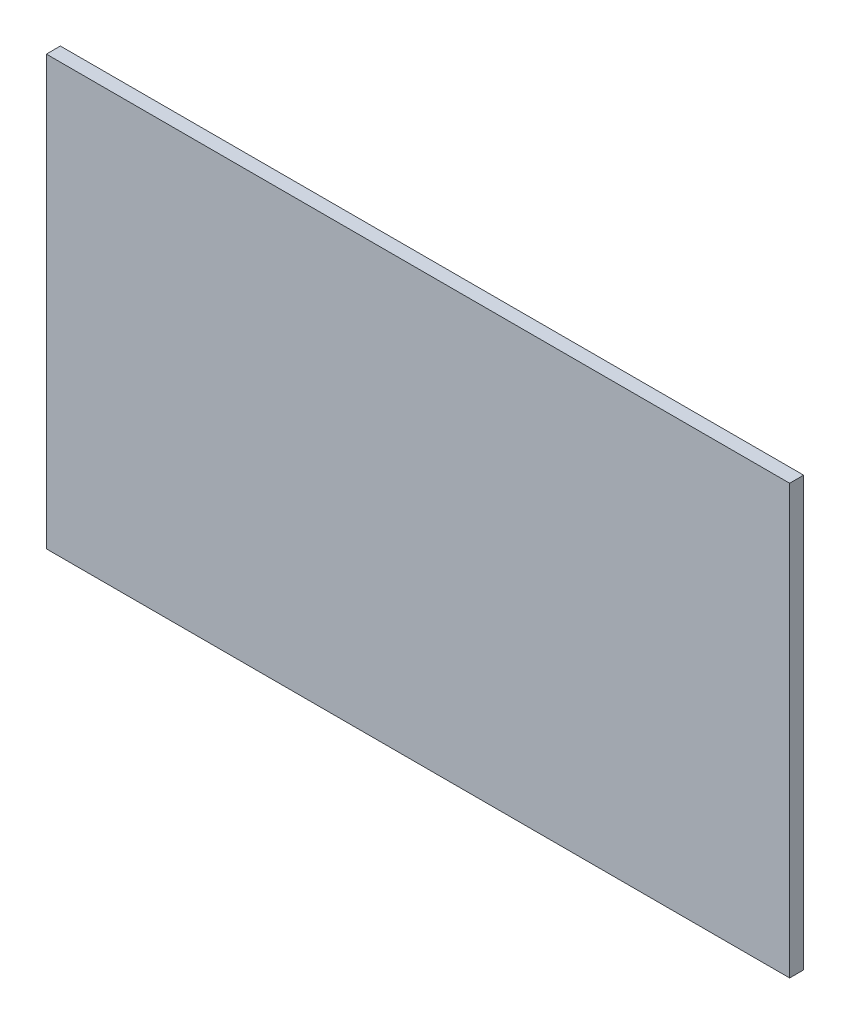
ISO-10303-21;
HEADER;
FILE_DESCRIPTION(('STEP AP214'),'2;1');
FILE_NAME('part.step','',(''),(''),'','','');
FILE_SCHEMA(('AUTOMOTIVE_DESIGN { 1 0 10303 214 1 1 1 1 }'));
ENDSEC;
DATA;
#1=APPLICATION_CONTEXT('core data for automotive mechanical design processes');
#2=APPLICATION_PROTOCOL_DEFINITION('international standard','automotive_design',2000,#1);
#3=PRODUCT_CONTEXT('',#1,'mechanical');
#4=PRODUCT('Part','Part','',(#3));
#5=PRODUCT_RELATED_PRODUCT_CATEGORY('part','',(#4));
#6=PRODUCT_DEFINITION_FORMATION('','',#4);
#7=PRODUCT_DEFINITION_CONTEXT('part definition',#1,'design');
#8=PRODUCT_DEFINITION('design','',#6,#7);
#9=PRODUCT_DEFINITION_SHAPE('','',#8);
#10=(LENGTH_UNIT() NAMED_UNIT(*) SI_UNIT(.MILLI.,.METRE.));
#11=(NAMED_UNIT(*) PLANE_ANGLE_UNIT() SI_UNIT($,.RADIAN.));
#12=(NAMED_UNIT(*) SI_UNIT($,.STERADIAN.) SOLID_ANGLE_UNIT());
#13=UNCERTAINTY_MEASURE_WITH_UNIT(LENGTH_MEASURE(1.E-05),#10,'distance_accuracy_value','');
#14=(GEOMETRIC_REPRESENTATION_CONTEXT(3) GLOBAL_UNCERTAINTY_ASSIGNED_CONTEXT((#13)) GLOBAL_UNIT_ASSIGNED_CONTEXT((#10,
#11,#12)) REPRESENTATION_CONTEXT('',''));
#15=CARTESIAN_POINT('',(0.,0.,0.));
#16=DIRECTION('',(0.,0.,1.));
#17=DIRECTION('',(1.,0.,0.));
#18=AXIS2_PLACEMENT_3D('',#15,#16,#17);
#19=CARTESIAN_POINT('',(-73.8944174376666,61.9928571428572,1.6));
#20=DIRECTION('',(1.,0.,0.));
#21=DIRECTION('',(0.,0.,-1.));
#22=AXIS2_PLACEMENT_3D('',#19,#20,#21);
#23=PLANE('',#22);
#24=DIRECTION('',(0.,-1.,0.));
#25=VECTOR('',#24,1.);
#26=CARTESIAN_POINT('',(-73.8944174376666,61.9928571428572,0.));
#27=LINE('',#26,#25);
#28=CARTESIAN_POINT('',(-73.8944174376666,61.9928571428572,0.));
#29=VERTEX_POINT('',#28);
#30=CARTESIAN_POINT('',(-73.8944174376666,12.9928571428572,0.));
#31=VERTEX_POINT('',#30);
#32=EDGE_CURVE('E96',#29,#31,#27,.T.);
#33=ORIENTED_EDGE('',*,*,#32,.T.);
#34=DIRECTION('',(0.,0.,-1.));
#35=VECTOR('',#34,1.);
#36=CARTESIAN_POINT('',(-73.8944174376666,12.9928571428572,1.6));
#37=LINE('',#36,#35);
#38=CARTESIAN_POINT('',(-73.8944174376666,12.9928571428572,1.6));
#39=VERTEX_POINT('',#38);
#40=EDGE_CURVE('E11',#39,#31,#37,.T.);
#41=ORIENTED_EDGE('',*,*,#40,.F.);
#42=DIRECTION('',(0.,-1.,0.));
#43=VECTOR('',#42,1.);
#44=CARTESIAN_POINT('',(-73.8944174376666,61.9928571428572,1.6));
#45=LINE('',#44,#43);
#46=CARTESIAN_POINT('',(-73.8944174376666,61.9928571428572,1.6));
#47=VERTEX_POINT('',#46);
#48=EDGE_CURVE('E84',#47,#39,#45,.T.);
#49=ORIENTED_EDGE('',*,*,#48,.F.);
#50=DIRECTION('',(0.,0.,-1.));
#51=VECTOR('',#50,1.);
#52=CARTESIAN_POINT('',(-73.8944174376666,61.9928571428572,1.6));
#53=LINE('',#52,#51);
#54=EDGE_CURVE('E92',#47,#29,#53,.T.);
#55=ORIENTED_EDGE('',*,*,#54,.T.);
#56=EDGE_LOOP('',(#33,#41,#49,#55));
#57=FACE_BOUND('',#56,.T.);
#58=ADVANCED_FACE('F33',(#57),#23,.F.);
#59=CARTESIAN_POINT('',(-73.8944174376666,12.9928571428572,1.6));
#60=DIRECTION('',(0.,1.,0.));
#61=DIRECTION('',(0.,0.,1.));
#62=AXIS2_PLACEMENT_3D('',#59,#60,#61);
#63=PLANE('',#62);
#64=DIRECTION('',(1.,0.,0.));
#65=VECTOR('',#64,1.);
#66=CARTESIAN_POINT('',(-73.8944174376666,12.9928571428572,0.));
#67=LINE('',#66,#65);
#68=CARTESIAN_POINT('',(11.1055825623334,12.9928571428572,0.));
#69=VERTEX_POINT('',#68);
#70=EDGE_CURVE('E88',#31,#69,#67,.T.);
#71=ORIENTED_EDGE('',*,*,#70,.T.);
#72=DIRECTION('',(0.,0.,-1.));
#73=VECTOR('',#72,1.);
#74=CARTESIAN_POINT('',(11.1055825623334,12.9928571428572,1.6));
#75=LINE('',#74,#73);
#76=CARTESIAN_POINT('',(11.1055825623334,12.9928571428572,1.6));
#77=VERTEX_POINT('',#76);
#78=EDGE_CURVE('E41',#77,#69,#75,.T.);
#79=ORIENTED_EDGE('',*,*,#78,.F.);
#80=DIRECTION('',(1.,0.,0.));
#81=VECTOR('',#80,1.);
#82=CARTESIAN_POINT('',(-73.8944174376666,12.9928571428572,1.6));
#83=LINE('',#82,#81);
#84=EDGE_CURVE('E79',#39,#77,#83,.T.);
#85=ORIENTED_EDGE('',*,*,#84,.F.);
#86=ORIENTED_EDGE('',*,*,#40,.T.);
#87=EDGE_LOOP('',(#71,#79,#85,#86));
#88=FACE_BOUND('',#87,.T.);
#89=ADVANCED_FACE('F87',(#88),#63,.F.);
#90=CARTESIAN_POINT('',(11.1055825623334,61.9928571428572,1.6));
#91=DIRECTION('',(-1.,0.,0.));
#92=DIRECTION('',(0.,0.,1.));
#93=AXIS2_PLACEMENT_3D('',#90,#91,#92);
#94=PLANE('',#93);
#95=DIRECTION('',(0.,1.,0.));
#96=VECTOR('',#95,1.);
#97=CARTESIAN_POINT('',(11.1055825623334,61.9928571428572,0.));
#98=LINE('',#97,#96);
#99=CARTESIAN_POINT('',(11.1055825623334,61.9928571428572,0.));
#100=VERTEX_POINT('',#99);
#101=EDGE_CURVE('E66',#69,#100,#98,.T.);
#102=ORIENTED_EDGE('',*,*,#101,.T.);
#103=DIRECTION('',(0.,0.,-1.));
#104=VECTOR('',#103,1.);
#105=CARTESIAN_POINT('',(11.1055825623334,61.9928571428572,1.6));
#106=LINE('',#105,#104);
#107=CARTESIAN_POINT('',(11.1055825623334,61.9928571428572,1.6));
#108=VERTEX_POINT('',#107);
#109=EDGE_CURVE('E89',#108,#100,#106,.T.);
#110=ORIENTED_EDGE('',*,*,#109,.F.);
#111=DIRECTION('',(0.,1.,0.));
#112=VECTOR('',#111,1.);
#113=CARTESIAN_POINT('',(11.1055825623334,61.9928571428572,1.6));
#114=LINE('',#113,#112);
#115=EDGE_CURVE('E82',#77,#108,#114,.T.);
#116=ORIENTED_EDGE('',*,*,#115,.F.);
#117=ORIENTED_EDGE('',*,*,#78,.T.);
#118=EDGE_LOOP('',(#102,#110,#116,#117));
#119=FACE_BOUND('',#118,.T.);
#120=ADVANCED_FACE('F90',(#119),#94,.F.);
#121=CARTESIAN_POINT('',(-73.8944174376666,61.9928571428572,1.6));
#122=DIRECTION('',(0.,-1.,0.));
#123=DIRECTION('',(0.,0.,-1.));
#124=AXIS2_PLACEMENT_3D('',#121,#122,#123);
#125=PLANE('',#124);
#126=DIRECTION('',(-1.,0.,0.));
#127=VECTOR('',#126,1.);
#128=CARTESIAN_POINT('',(-73.8944174376666,61.9928571428572,0.));
#129=LINE('',#128,#127);
#130=EDGE_CURVE('E72',#100,#29,#129,.T.);
#131=ORIENTED_EDGE('',*,*,#130,.T.);
#132=ORIENTED_EDGE('',*,*,#54,.F.);
#133=DIRECTION('',(-1.,0.,0.));
#134=VECTOR('',#133,1.);
#135=CARTESIAN_POINT('',(-73.8944174376666,61.9928571428572,1.6));
#136=LINE('',#135,#134);
#137=EDGE_CURVE('E49',#108,#47,#136,.T.);
#138=ORIENTED_EDGE('',*,*,#137,.F.);
#139=ORIENTED_EDGE('',*,*,#109,.T.);
#140=EDGE_LOOP('',(#131,#132,#138,#139));
#141=FACE_BOUND('',#140,.T.);
#142=ADVANCED_FACE('F103',(#141),#125,.F.);
#143=CARTESIAN_POINT('',(0.,0.,1.6));
#144=DIRECTION('',(0.,0.,1.));
#145=DIRECTION('',(1.,0.,0.));
#146=AXIS2_PLACEMENT_3D('',#143,#144,#145);
#147=PLANE('',#146);
#148=ORIENTED_EDGE('',*,*,#48,.T.);
#149=ORIENTED_EDGE('',*,*,#84,.T.);
#150=ORIENTED_EDGE('',*,*,#115,.T.);
#151=ORIENTED_EDGE('',*,*,#137,.T.);
#152=EDGE_LOOP('',(#148,#149,#150,#151));
#153=FACE_BOUND('',#152,.T.);
#154=ADVANCED_FACE('F80',(#153),#147,.T.);
#155=CARTESIAN_POINT('',(0.,0.,0.));
#156=DIRECTION('',(0.,0.,1.));
#157=DIRECTION('',(1.,0.,0.));
#158=AXIS2_PLACEMENT_3D('',#155,#156,#157);
#159=PLANE('',#158);
#160=ORIENTED_EDGE('',*,*,#32,.F.);
#161=ORIENTED_EDGE('',*,*,#130,.F.);
#162=ORIENTED_EDGE('',*,*,#101,.F.);
#163=ORIENTED_EDGE('',*,*,#70,.F.);
#164=EDGE_LOOP('',(#160,#161,#162,#163));
#165=FACE_BOUND('',#164,.T.);
#166=ADVANCED_FACE('F106',(#165),#159,.F.);
#167=CLOSED_SHELL('',(#58,#89,#120,#142,#154,#166));
#168=MANIFOLD_SOLID_BREP('B2',#167);
#169=ADVANCED_BREP_SHAPE_REPRESENTATION('',(#18,#168),#14);
#170=SHAPE_DEFINITION_REPRESENTATION(#9,#169);
ENDSEC;
END-ISO-10303-21;
